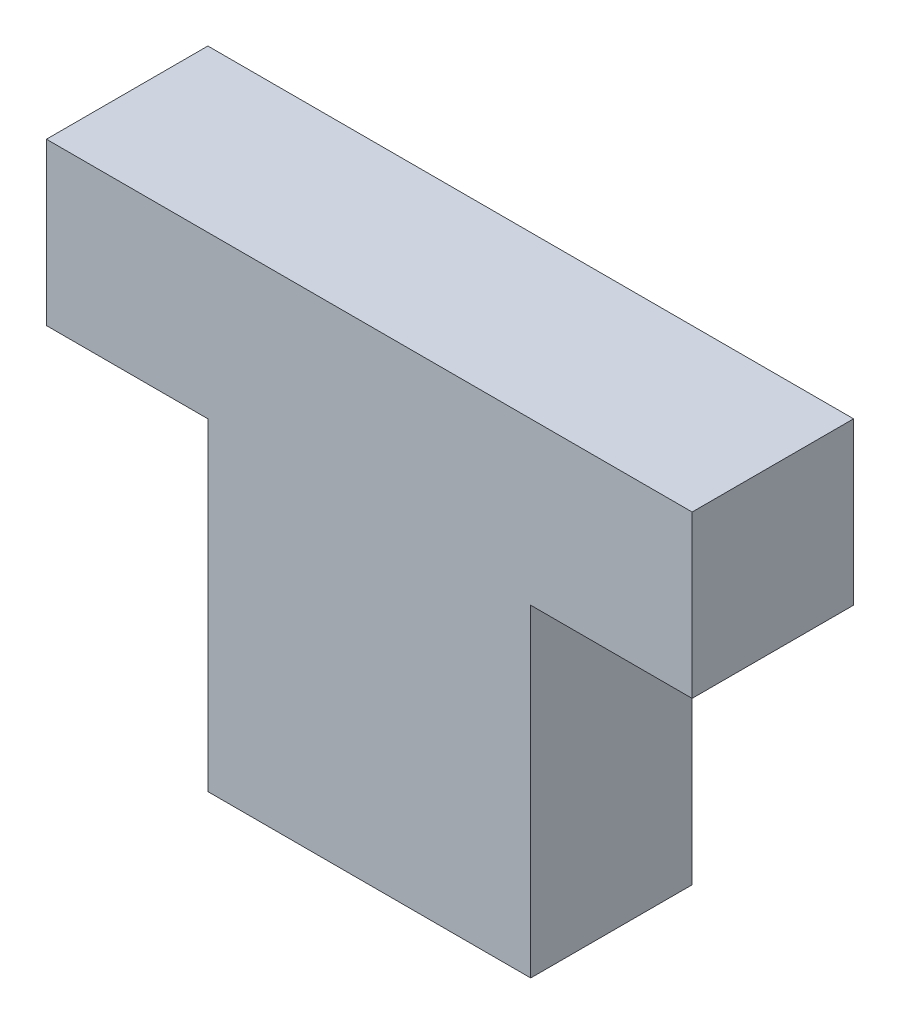
ISO-10303-21;
HEADER;
FILE_DESCRIPTION(('STEP AP214'),'2;1');
FILE_NAME('part.step','',(''),(''),'','','');
FILE_SCHEMA(('AUTOMOTIVE_DESIGN { 1 0 10303 214 1 1 1 1 }'));
ENDSEC;
DATA;
#1=APPLICATION_CONTEXT('core data for automotive mechanical design processes');
#2=APPLICATION_PROTOCOL_DEFINITION('international standard','automotive_design',2000,#1);
#3=PRODUCT_CONTEXT('',#1,'mechanical');
#4=PRODUCT('Part','Part','',(#3));
#5=PRODUCT_RELATED_PRODUCT_CATEGORY('part','',(#4));
#6=PRODUCT_DEFINITION_FORMATION('','',#4);
#7=PRODUCT_DEFINITION_CONTEXT('part definition',#1,'design');
#8=PRODUCT_DEFINITION('design','',#6,#7);
#9=PRODUCT_DEFINITION_SHAPE('','',#8);
#10=(LENGTH_UNIT() NAMED_UNIT(*) SI_UNIT(.MILLI.,.METRE.));
#11=(NAMED_UNIT(*) PLANE_ANGLE_UNIT() SI_UNIT($,.RADIAN.));
#12=(NAMED_UNIT(*) SI_UNIT($,.STERADIAN.) SOLID_ANGLE_UNIT());
#13=UNCERTAINTY_MEASURE_WITH_UNIT(LENGTH_MEASURE(1.E-05),#10,'distance_accuracy_value','');
#14=(GEOMETRIC_REPRESENTATION_CONTEXT(3) GLOBAL_UNCERTAINTY_ASSIGNED_CONTEXT((#13)) GLOBAL_UNIT_ASSIGNED_CONTEXT((#10,
#11,#12)) REPRESENTATION_CONTEXT('',''));
#15=CARTESIAN_POINT('',(0.,0.,0.));
#16=DIRECTION('',(0.,0.,1.));
#17=DIRECTION('',(1.,0.,0.));
#18=AXIS2_PLACEMENT_3D('',#15,#16,#17);
#19=CARTESIAN_POINT('',(0.,0.,5.));
#20=DIRECTION('',(1.,0.,0.));
#21=DIRECTION('',(0.,1.,0.));
#22=AXIS2_PLACEMENT_3D('',#19,#20,#21);
#23=PLANE('',#22);
#24=DIRECTION('',(0.,-1.,0.));
#25=VECTOR('',#24,1.);
#26=CARTESIAN_POINT('',(0.,0.,0.));
#27=LINE('',#26,#25);
#28=CARTESIAN_POINT('',(0.,0.,0.));
#29=VERTEX_POINT('',#28);
#30=CARTESIAN_POINT('',(0.,-10.,0.));
#31=VERTEX_POINT('',#30);
#32=EDGE_CURVE('E130',#29,#31,#27,.T.);
#33=ORIENTED_EDGE('',*,*,#32,.F.);
#34=DIRECTION('',(0.,0.,-1.));
#35=VECTOR('',#34,1.);
#36=CARTESIAN_POINT('',(0.,0.,5.));
#37=LINE('',#36,#35);
#38=CARTESIAN_POINT('',(0.,0.,5.));
#39=VERTEX_POINT('',#38);
#40=EDGE_CURVE('E11',#39,#29,#37,.T.);
#41=ORIENTED_EDGE('',*,*,#40,.F.);
#42=DIRECTION('',(0.,-1.,0.));
#43=VECTOR('',#42,1.);
#44=CARTESIAN_POINT('',(0.,0.,5.));
#45=LINE('',#44,#43);
#46=CARTESIAN_POINT('',(0.,-10.,5.));
#47=VERTEX_POINT('',#46);
#48=EDGE_CURVE('E148',#39,#47,#45,.T.);
#49=ORIENTED_EDGE('',*,*,#48,.T.);
#50=DIRECTION('',(0.,0.,-1.));
#51=VECTOR('',#50,1.);
#52=CARTESIAN_POINT('',(0.,-10.,5.));
#53=LINE('',#52,#51);
#54=EDGE_CURVE('E50',#47,#31,#53,.T.);
#55=ORIENTED_EDGE('',*,*,#54,.T.);
#56=EDGE_LOOP('',(#33,#41,#49,#55));
#57=FACE_BOUND('',#56,.T.);
#58=ADVANCED_FACE('F34',(#57),#23,.T.);
#59=CARTESIAN_POINT('',(0.,0.,5.));
#60=DIRECTION('',(0.,1.,0.));
#61=DIRECTION('',(0.,0.,1.));
#62=AXIS2_PLACEMENT_3D('',#59,#60,#61);
#63=PLANE('',#62);
#64=DIRECTION('',(1.,0.,0.));
#65=VECTOR('',#64,1.);
#66=CARTESIAN_POINT('',(0.,0.,0.));
#67=LINE('',#66,#65);
#68=CARTESIAN_POINT('',(5.,0.,0.));
#69=VERTEX_POINT('',#68);
#70=EDGE_CURVE('E132',#29,#69,#67,.T.);
#71=ORIENTED_EDGE('',*,*,#70,.T.);
#72=DIRECTION('',(0.,0.,-1.));
#73=VECTOR('',#72,1.);
#74=CARTESIAN_POINT('',(5.,0.,5.));
#75=LINE('',#74,#73);
#76=CARTESIAN_POINT('',(5.,0.,5.));
#77=VERTEX_POINT('',#76);
#78=EDGE_CURVE('E42',#77,#69,#75,.T.);
#79=ORIENTED_EDGE('',*,*,#78,.F.);
#80=DIRECTION('',(1.,0.,0.));
#81=VECTOR('',#80,1.);
#82=CARTESIAN_POINT('',(0.,0.,5.));
#83=LINE('',#82,#81);
#84=EDGE_CURVE('E113',#39,#77,#83,.T.);
#85=ORIENTED_EDGE('',*,*,#84,.F.);
#86=ORIENTED_EDGE('',*,*,#40,.T.);
#87=EDGE_LOOP('',(#71,#79,#85,#86));
#88=FACE_BOUND('',#87,.T.);
#89=ADVANCED_FACE('F186',(#88),#63,.F.);
#90=CARTESIAN_POINT('',(5.,0.,5.));
#91=DIRECTION('',(-1.,0.,0.));
#92=DIRECTION('',(0.,0.,1.));
#93=AXIS2_PLACEMENT_3D('',#90,#91,#92);
#94=PLANE('',#93);
#95=DIRECTION('',(0.,1.,0.));
#96=VECTOR('',#95,1.);
#97=CARTESIAN_POINT('',(5.,0.,0.));
#98=LINE('',#97,#96);
#99=CARTESIAN_POINT('',(5.,5.,0.));
#100=VERTEX_POINT('',#99);
#101=EDGE_CURVE('E134',#69,#100,#98,.T.);
#102=ORIENTED_EDGE('',*,*,#101,.T.);
#103=DIRECTION('',(0.,0.,-1.));
#104=VECTOR('',#103,1.);
#105=CARTESIAN_POINT('',(5.,5.,5.));
#106=LINE('',#105,#104);
#107=CARTESIAN_POINT('',(5.,5.,5.));
#108=VERTEX_POINT('',#107);
#109=EDGE_CURVE('E154',#108,#100,#106,.T.);
#110=ORIENTED_EDGE('',*,*,#109,.F.);
#111=DIRECTION('',(0.,1.,0.));
#112=VECTOR('',#111,1.);
#113=CARTESIAN_POINT('',(5.,0.,5.));
#114=LINE('',#113,#112);
#115=EDGE_CURVE('E162',#77,#108,#114,.T.);
#116=ORIENTED_EDGE('',*,*,#115,.F.);
#117=ORIENTED_EDGE('',*,*,#78,.T.);
#118=EDGE_LOOP('',(#102,#110,#116,#117));
#119=FACE_BOUND('',#118,.T.);
#120=ADVANCED_FACE('F160',(#119),#94,.F.);
#121=CARTESIAN_POINT('',(0.,5.,5.));
#122=DIRECTION('',(0.,1.,0.));
#123=DIRECTION('',(0.,0.,1.));
#124=AXIS2_PLACEMENT_3D('',#121,#122,#123);
#125=PLANE('',#124);
#126=DIRECTION('',(1.,0.,0.));
#127=VECTOR('',#126,1.);
#128=CARTESIAN_POINT('',(0.,5.,0.));
#129=LINE('',#128,#127);
#130=CARTESIAN_POINT('',(-15.,5.,0.));
#131=VERTEX_POINT('',#130);
#132=EDGE_CURVE('E137',#131,#100,#129,.T.);
#133=ORIENTED_EDGE('',*,*,#132,.F.);
#134=DIRECTION('',(0.,0.,-1.));
#135=VECTOR('',#134,1.);
#136=CARTESIAN_POINT('',(-15.,5.,5.));
#137=LINE('',#136,#135);
#138=CARTESIAN_POINT('',(-15.,5.,5.));
#139=VERTEX_POINT('',#138);
#140=EDGE_CURVE('E152',#139,#131,#137,.T.);
#141=ORIENTED_EDGE('',*,*,#140,.F.);
#142=DIRECTION('',(1.,0.,0.));
#143=VECTOR('',#142,1.);
#144=CARTESIAN_POINT('',(0.,5.,5.));
#145=LINE('',#144,#143);
#146=EDGE_CURVE('E172',#139,#108,#145,.T.);
#147=ORIENTED_EDGE('',*,*,#146,.T.);
#148=ORIENTED_EDGE('',*,*,#109,.T.);
#149=EDGE_LOOP('',(#133,#141,#147,#148));
#150=FACE_BOUND('',#149,.T.);
#151=ADVANCED_FACE('F170',(#150),#125,.T.);
#152=CARTESIAN_POINT('',(-15.,0.,5.));
#153=DIRECTION('',(-1.,0.,0.));
#154=DIRECTION('',(0.,-1.,0.));
#155=AXIS2_PLACEMENT_3D('',#152,#153,#154);
#156=PLANE('',#155);
#157=DIRECTION('',(0.,1.,0.));
#158=VECTOR('',#157,1.);
#159=CARTESIAN_POINT('',(-15.,0.,0.));
#160=LINE('',#159,#158);
#161=CARTESIAN_POINT('',(-15.,0.,0.));
#162=VERTEX_POINT('',#161);
#163=EDGE_CURVE('E140',#162,#131,#160,.T.);
#164=ORIENTED_EDGE('',*,*,#163,.F.);
#165=DIRECTION('',(0.,0.,-1.));
#166=VECTOR('',#165,1.);
#167=CARTESIAN_POINT('',(-15.,0.,5.));
#168=LINE('',#167,#166);
#169=CARTESIAN_POINT('',(-15.,0.,5.));
#170=VERTEX_POINT('',#169);
#171=EDGE_CURVE('E121',#170,#162,#168,.T.);
#172=ORIENTED_EDGE('',*,*,#171,.F.);
#173=DIRECTION('',(0.,1.,0.));
#174=VECTOR('',#173,1.);
#175=CARTESIAN_POINT('',(-15.,0.,5.));
#176=LINE('',#175,#174);
#177=EDGE_CURVE('E110',#170,#139,#176,.T.);
#178=ORIENTED_EDGE('',*,*,#177,.T.);
#179=ORIENTED_EDGE('',*,*,#140,.T.);
#180=EDGE_LOOP('',(#164,#172,#178,#179));
#181=FACE_BOUND('',#180,.T.);
#182=ADVANCED_FACE('F196',(#181),#156,.T.);
#183=CARTESIAN_POINT('',(-10.,0.,0.));
#184=VERTEX_POINT('',#183);
#185=EDGE_CURVE('E118',#162,#184,#67,.T.);
#186=ORIENTED_EDGE('',*,*,#185,.T.);
#187=DIRECTION('',(0.,0.,-1.));
#188=VECTOR('',#187,1.);
#189=CARTESIAN_POINT('',(-10.,0.,5.));
#190=LINE('',#189,#188);
#191=CARTESIAN_POINT('',(-10.,0.,5.));
#192=VERTEX_POINT('',#191);
#193=EDGE_CURVE('E115',#192,#184,#190,.T.);
#194=ORIENTED_EDGE('',*,*,#193,.F.);
#195=EDGE_CURVE('E101',#170,#192,#83,.T.);
#196=ORIENTED_EDGE('',*,*,#195,.F.);
#197=ORIENTED_EDGE('',*,*,#171,.T.);
#198=EDGE_LOOP('',(#186,#194,#196,#197));
#199=FACE_BOUND('',#198,.T.);
#200=ADVANCED_FACE('F116',(#199),#63,.F.);
#201=CARTESIAN_POINT('',(-10.,0.,5.));
#202=DIRECTION('',(1.,0.,0.));
#203=DIRECTION('',(0.,1.,0.));
#204=AXIS2_PLACEMENT_3D('',#201,#202,#203);
#205=PLANE('',#204);
#206=DIRECTION('',(0.,-1.,0.));
#207=VECTOR('',#206,1.);
#208=CARTESIAN_POINT('',(-10.,0.,0.));
#209=LINE('',#208,#207);
#210=CARTESIAN_POINT('',(-10.,-10.,0.));
#211=VERTEX_POINT('',#210);
#212=EDGE_CURVE('E143',#184,#211,#209,.T.);
#213=ORIENTED_EDGE('',*,*,#212,.T.);
#214=DIRECTION('',(0.,0.,-1.));
#215=VECTOR('',#214,1.);
#216=CARTESIAN_POINT('',(-10.,-10.,5.));
#217=LINE('',#216,#215);
#218=CARTESIAN_POINT('',(-10.,-10.,5.));
#219=VERTEX_POINT('',#218);
#220=EDGE_CURVE('E76',#219,#211,#217,.T.);
#221=ORIENTED_EDGE('',*,*,#220,.F.);
#222=DIRECTION('',(0.,-1.,0.));
#223=VECTOR('',#222,1.);
#224=CARTESIAN_POINT('',(-10.,0.,5.));
#225=LINE('',#224,#223);
#226=EDGE_CURVE('E107',#192,#219,#225,.T.);
#227=ORIENTED_EDGE('',*,*,#226,.F.);
#228=ORIENTED_EDGE('',*,*,#193,.T.);
#229=EDGE_LOOP('',(#213,#221,#227,#228));
#230=FACE_BOUND('',#229,.T.);
#231=ADVANCED_FACE('F123',(#230),#205,.F.);
#232=CARTESIAN_POINT('',(0.,-10.,5.));
#233=DIRECTION('',(0.,-1.,0.));
#234=DIRECTION('',(0.,0.,-1.));
#235=AXIS2_PLACEMENT_3D('',#232,#233,#234);
#236=PLANE('',#235);
#237=DIRECTION('',(-1.,0.,0.));
#238=VECTOR('',#237,1.);
#239=CARTESIAN_POINT('',(0.,-10.,0.));
#240=LINE('',#239,#238);
#241=EDGE_CURVE('E145',#31,#211,#240,.T.);
#242=ORIENTED_EDGE('',*,*,#241,.F.);
#243=ORIENTED_EDGE('',*,*,#54,.F.);
#244=DIRECTION('',(-1.,0.,0.));
#245=VECTOR('',#244,1.);
#246=CARTESIAN_POINT('',(0.,-10.,5.));
#247=LINE('',#246,#245);
#248=EDGE_CURVE('E124',#47,#219,#247,.T.);
#249=ORIENTED_EDGE('',*,*,#248,.T.);
#250=ORIENTED_EDGE('',*,*,#220,.T.);
#251=EDGE_LOOP('',(#242,#243,#249,#250));
#252=FACE_BOUND('',#251,.T.);
#253=ADVANCED_FACE('F175',(#252),#236,.T.);
#254=CARTESIAN_POINT('',(0.,0.,5.));
#255=DIRECTION('',(0.,0.,1.));
#256=DIRECTION('',(1.,0.,0.));
#257=AXIS2_PLACEMENT_3D('',#254,#255,#256);
#258=PLANE('',#257);
#259=ORIENTED_EDGE('',*,*,#48,.F.);
#260=ORIENTED_EDGE('',*,*,#84,.T.);
#261=ORIENTED_EDGE('',*,*,#115,.T.);
#262=ORIENTED_EDGE('',*,*,#146,.F.);
#263=ORIENTED_EDGE('',*,*,#177,.F.);
#264=ORIENTED_EDGE('',*,*,#195,.T.);
#265=ORIENTED_EDGE('',*,*,#226,.T.);
#266=ORIENTED_EDGE('',*,*,#248,.F.);
#267=EDGE_LOOP('',(#259,#260,#261,#262,#263,#264,#265,#266));
#268=FACE_BOUND('',#267,.T.);
#269=ADVANCED_FACE('F104',(#268),#258,.T.);
#270=CARTESIAN_POINT('',(0.,0.,0.));
#271=DIRECTION('',(0.,0.,1.));
#272=DIRECTION('',(1.,0.,0.));
#273=AXIS2_PLACEMENT_3D('',#270,#271,#272);
#274=PLANE('',#273);
#275=ORIENTED_EDGE('',*,*,#32,.T.);
#276=ORIENTED_EDGE('',*,*,#241,.T.);
#277=ORIENTED_EDGE('',*,*,#212,.F.);
#278=ORIENTED_EDGE('',*,*,#185,.F.);
#279=ORIENTED_EDGE('',*,*,#163,.T.);
#280=ORIENTED_EDGE('',*,*,#132,.T.);
#281=ORIENTED_EDGE('',*,*,#101,.F.);
#282=ORIENTED_EDGE('',*,*,#70,.F.);
#283=EDGE_LOOP('',(#275,#276,#277,#278,#279,#280,#281,#282));
#284=FACE_BOUND('',#283,.T.);
#285=ADVANCED_FACE('F166',(#284),#274,.F.);
#286=CLOSED_SHELL('',(#58,#89,#120,#151,#182,#200,#231,#253,#269,#285));
#287=MANIFOLD_SOLID_BREP('B2',#286);
#288=ADVANCED_BREP_SHAPE_REPRESENTATION('',(#18,#287),#14);
#289=SHAPE_DEFINITION_REPRESENTATION(#9,#288);
ENDSEC;
END-ISO-10303-21;
